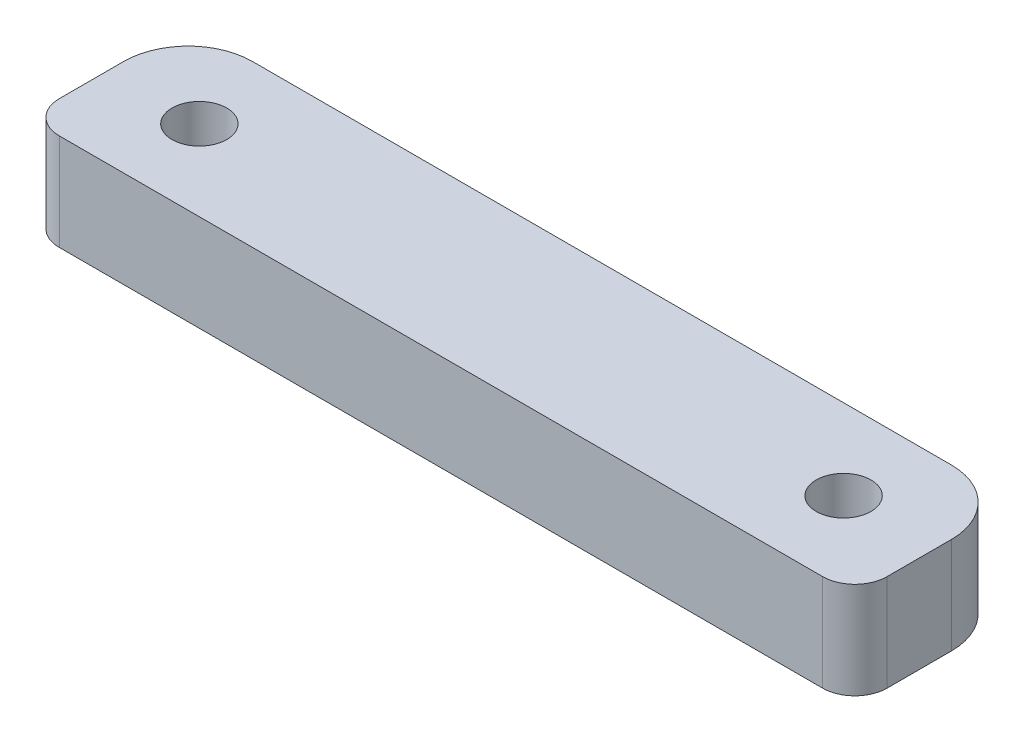
ISO-10303-21;
HEADER;
FILE_DESCRIPTION(('STEP AP214'),'2;1');
FILE_NAME('part.step','',(''),(''),'','','');
FILE_SCHEMA(('AUTOMOTIVE_DESIGN { 1 0 10303 214 1 1 1 1 }'));
ENDSEC;
DATA;
#1=APPLICATION_CONTEXT('core data for automotive mechanical design processes');
#2=APPLICATION_PROTOCOL_DEFINITION('international standard','automotive_design',2000,#1);
#3=PRODUCT_CONTEXT('',#1,'mechanical');
#4=PRODUCT('Part','Part','',(#3));
#5=PRODUCT_RELATED_PRODUCT_CATEGORY('part','',(#4));
#6=PRODUCT_DEFINITION_FORMATION('','',#4);
#7=PRODUCT_DEFINITION_CONTEXT('part definition',#1,'design');
#8=PRODUCT_DEFINITION('design','',#6,#7);
#9=PRODUCT_DEFINITION_SHAPE('','',#8);
#10=(LENGTH_UNIT() NAMED_UNIT(*) SI_UNIT(.MILLI.,.METRE.));
#11=(NAMED_UNIT(*) PLANE_ANGLE_UNIT() SI_UNIT($,.RADIAN.));
#12=(NAMED_UNIT(*) SI_UNIT($,.STERADIAN.) SOLID_ANGLE_UNIT());
#13=UNCERTAINTY_MEASURE_WITH_UNIT(LENGTH_MEASURE(1.E-05),#10,'distance_accuracy_value','');
#14=(GEOMETRIC_REPRESENTATION_CONTEXT(3) GLOBAL_UNCERTAINTY_ASSIGNED_CONTEXT((#13)) GLOBAL_UNIT_ASSIGNED_CONTEXT((#10,
#11,#12)) REPRESENTATION_CONTEXT('',''));
#15=CARTESIAN_POINT('',(0.,0.,0.));
#16=DIRECTION('',(0.,0.,1.));
#17=DIRECTION('',(1.,0.,0.));
#18=AXIS2_PLACEMENT_3D('',#15,#16,#17);
#19=CARTESIAN_POINT('',(0.,6.,-5.));
#20=DIRECTION('',(0.,0.,-1.));
#21=DIRECTION('',(-1.,0.,0.));
#22=AXIS2_PLACEMENT_3D('',#19,#20,#21);
#23=PLANE('',#22);
#24=DIRECTION('',(1.,0.,0.));
#25=VECTOR('',#24,1.);
#26=CARTESIAN_POINT('',(0.,6.,-5.));
#27=LINE('',#26,#25);
#28=CARTESIAN_POINT('',(-21.7,6.,-5.));
#29=VERTEX_POINT('',#28);
#30=CARTESIAN_POINT('',(21.7,6.,-5.));
#31=VERTEX_POINT('',#30);
#32=EDGE_CURVE('E177',#29,#31,#27,.T.);
#33=ORIENTED_EDGE('',*,*,#32,.T.);
#34=DIRECTION('',(0.,-1.,0.));
#35=VECTOR('',#34,1.);
#36=CARTESIAN_POINT('',(21.7,0.,-5.));
#37=LINE('',#36,#35);
#38=CARTESIAN_POINT('',(21.7,0.,-5.));
#39=VERTEX_POINT('',#38);
#40=EDGE_CURVE('E215',#31,#39,#37,.T.);
#41=ORIENTED_EDGE('',*,*,#40,.T.);
#42=DIRECTION('',(1.,0.,0.));
#43=VECTOR('',#42,1.);
#44=CARTESIAN_POINT('',(0.,0.,-5.));
#45=LINE('',#44,#43);
#46=CARTESIAN_POINT('',(2.65,0.,-5.));
#47=VERTEX_POINT('',#46);
#48=EDGE_CURVE('E168',#47,#39,#45,.T.);
#49=ORIENTED_EDGE('',*,*,#48,.F.);
#50=DIRECTION('',(0.,-1.,0.));
#51=VECTOR('',#50,1.);
#52=CARTESIAN_POINT('',(2.65,3.8,-5.));
#53=LINE('',#52,#51);
#54=CARTESIAN_POINT('',(2.65,3.8,-5.));
#55=VERTEX_POINT('',#54);
#56=EDGE_CURVE('E164',#55,#47,#53,.T.);
#57=ORIENTED_EDGE('',*,*,#56,.F.);
#58=DIRECTION('',(1.,0.,0.));
#59=VECTOR('',#58,1.);
#60=CARTESIAN_POINT('',(0.,3.8,-5.));
#61=LINE('',#60,#59);
#62=CARTESIAN_POINT('',(-2.65,3.8,-5.));
#63=VERTEX_POINT('',#62);
#64=EDGE_CURVE('E143',#63,#55,#61,.T.);
#65=ORIENTED_EDGE('',*,*,#64,.F.);
#66=DIRECTION('',(0.,-1.,0.));
#67=VECTOR('',#66,1.);
#68=CARTESIAN_POINT('',(-2.65,3.8,-5.));
#69=LINE('',#68,#67);
#70=CARTESIAN_POINT('',(-2.65,0.,-5.));
#71=VERTEX_POINT('',#70);
#72=EDGE_CURVE('E170',#63,#71,#69,.T.);
#73=ORIENTED_EDGE('',*,*,#72,.T.);
#74=CARTESIAN_POINT('',(-21.7,0.,-5.));
#75=VERTEX_POINT('',#74);
#76=EDGE_CURVE('E197',#75,#71,#45,.T.);
#77=ORIENTED_EDGE('',*,*,#76,.F.);
#78=DIRECTION('',(0.,-1.,0.));
#79=VECTOR('',#78,1.);
#80=CARTESIAN_POINT('',(-21.7,6.,-5.));
#81=LINE('',#80,#79);
#82=EDGE_CURVE('E195',#75,#29,#81,.F.);
#83=ORIENTED_EDGE('',*,*,#82,.T.);
#84=EDGE_LOOP('',(#33,#41,#49,#57,#65,#73,#77,#83));
#85=FACE_BOUND('',#84,.T.);
#86=ADVANCED_FACE('F45',(#85),#23,.T.);
#87=CARTESIAN_POINT('',(0.,0.,0.));
#88=DIRECTION('',(0.,1.,0.));
#89=DIRECTION('',(0.,0.,1.));
#90=AXIS2_PLACEMENT_3D('',#87,#88,#89);
#91=PLANE('',#90);
#92=CARTESIAN_POINT('',(20.,0.,0.));
#93=DIRECTION('',(0.,1.,0.));
#94=DIRECTION('',(0.,0.,1.));
#95=AXIS2_PLACEMENT_3D('',#92,#93,#94);
#96=CIRCLE('',#95,1.7);
#97=CARTESIAN_POINT('',(20.,0.,1.7));
#98=VERTEX_POINT('',#97);
#99=EDGE_CURVE('E178',#98,#98,#96,.F.);
#100=ORIENTED_EDGE('',*,*,#99,.F.);
#101=EDGE_LOOP('',(#100));
#102=FACE_BOUND('',#101,.T.);
#103=CARTESIAN_POINT('',(-20.,0.,0.));
#104=DIRECTION('',(0.,1.,0.));
#105=DIRECTION('',(0.,0.,1.));
#106=AXIS2_PLACEMENT_3D('',#103,#104,#105);
#107=CIRCLE('',#106,1.7);
#108=CARTESIAN_POINT('',(-20.,0.,1.7));
#109=VERTEX_POINT('',#108);
#110=EDGE_CURVE('E206',#109,#109,#107,.T.);
#111=ORIENTED_EDGE('',*,*,#110,.T.);
#112=EDGE_LOOP('',(#111));
#113=FACE_BOUND('',#112,.T.);
#114=DIRECTION('',(0.,0.,-1.));
#115=VECTOR('',#114,1.);
#116=CARTESIAN_POINT('',(25.7,0.,0.));
#117=LINE('',#116,#115);
#118=CARTESIAN_POINT('',(25.7,0.,3.));
#119=VERTEX_POINT('',#118);
#120=CARTESIAN_POINT('',(25.7,0.,-1.));
#121=VERTEX_POINT('',#120);
#122=EDGE_CURVE('E163',#119,#121,#117,.T.);
#123=ORIENTED_EDGE('',*,*,#122,.F.);
#124=CARTESIAN_POINT('',(23.7,0.,3.));
#125=DIRECTION('',(0.,1.,0.));
#126=DIRECTION('',(0.,0.,1.));
#127=AXIS2_PLACEMENT_3D('',#124,#125,#126);
#128=CIRCLE('',#127,2.);
#129=CARTESIAN_POINT('',(23.7,0.,5.));
#130=VERTEX_POINT('',#129);
#131=EDGE_CURVE('E248',#119,#130,#128,.F.);
#132=ORIENTED_EDGE('',*,*,#131,.T.);
#133=DIRECTION('',(1.,0.,0.));
#134=VECTOR('',#133,1.);
#135=CARTESIAN_POINT('',(0.,0.,5.));
#136=LINE('',#135,#134);
#137=CARTESIAN_POINT('',(-23.7,0.,5.));
#138=VERTEX_POINT('',#137);
#139=EDGE_CURVE('E203',#138,#130,#136,.T.);
#140=ORIENTED_EDGE('',*,*,#139,.F.);
#141=CARTESIAN_POINT('',(-23.7,0.,3.));
#142=DIRECTION('',(0.,1.,0.));
#143=DIRECTION('',(0.,0.,1.));
#144=AXIS2_PLACEMENT_3D('',#141,#142,#143);
#145=CIRCLE('',#144,2.);
#146=CARTESIAN_POINT('',(-25.7,0.,3.));
#147=VERTEX_POINT('',#146);
#148=EDGE_CURVE('E245',#138,#147,#145,.F.);
#149=ORIENTED_EDGE('',*,*,#148,.T.);
#150=DIRECTION('',(0.,0.,-1.));
#151=VECTOR('',#150,1.);
#152=CARTESIAN_POINT('',(-25.7,0.,0.));
#153=LINE('',#152,#151);
#154=CARTESIAN_POINT('',(-25.7,0.,-1.));
#155=VERTEX_POINT('',#154);
#156=EDGE_CURVE('E200',#147,#155,#153,.T.);
#157=ORIENTED_EDGE('',*,*,#156,.T.);
#158=CARTESIAN_POINT('',(-21.7,0.,-1.));
#159=DIRECTION('',(0.,1.,0.));
#160=DIRECTION('',(0.,0.,1.));
#161=AXIS2_PLACEMENT_3D('',#158,#159,#160);
#162=CIRCLE('',#161,4.);
#163=EDGE_CURVE('E219',#155,#75,#162,.F.);
#164=ORIENTED_EDGE('',*,*,#163,.T.);
#165=ORIENTED_EDGE('',*,*,#76,.T.);
#166=DIRECTION('',(0.,0.,-1.));
#167=VECTOR('',#166,1.);
#168=CARTESIAN_POINT('',(-2.65,0.,0.));
#169=LINE('',#168,#167);
#170=CARTESIAN_POINT('',(-2.65,0.,2.2));
#171=VERTEX_POINT('',#170);
#172=EDGE_CURVE('E157',#171,#71,#169,.T.);
#173=ORIENTED_EDGE('',*,*,#172,.F.);
#174=DIRECTION('',(1.,0.,0.));
#175=VECTOR('',#174,1.);
#176=CARTESIAN_POINT('',(0.,0.,2.2));
#177=LINE('',#176,#175);
#178=CARTESIAN_POINT('',(2.65,0.,2.2));
#179=VERTEX_POINT('',#178);
#180=EDGE_CURVE('E303',#171,#179,#177,.T.);
#181=ORIENTED_EDGE('',*,*,#180,.T.);
#182=DIRECTION('',(0.,0.,-1.));
#183=VECTOR('',#182,1.);
#184=CARTESIAN_POINT('',(2.65,0.,0.));
#185=LINE('',#184,#183);
#186=EDGE_CURVE('E161',#179,#47,#185,.T.);
#187=ORIENTED_EDGE('',*,*,#186,.T.);
#188=ORIENTED_EDGE('',*,*,#48,.T.);
#189=CARTESIAN_POINT('',(21.7,0.,-1.));
#190=DIRECTION('',(0.,1.,0.));
#191=DIRECTION('',(0.,0.,1.));
#192=AXIS2_PLACEMENT_3D('',#189,#190,#191);
#193=CIRCLE('',#192,4.);
#194=EDGE_CURVE('E222',#39,#121,#193,.F.);
#195=ORIENTED_EDGE('',*,*,#194,.T.);
#196=EDGE_LOOP('',(#123,#132,#140,#149,#157,#164,#165,#173,#181,#187,#188,#195));
#197=FACE_BOUND('',#196,.T.);
#198=ADVANCED_FACE('F275',(#102,#113,#197),#91,.F.);
#199=CARTESIAN_POINT('',(25.7,6.,0.));
#200=DIRECTION('',(-1.,0.,0.));
#201=DIRECTION('',(0.,0.,1.));
#202=AXIS2_PLACEMENT_3D('',#199,#200,#201);
#203=PLANE('',#202);
#204=DIRECTION('',(0.,0.,-1.));
#205=VECTOR('',#204,1.);
#206=CARTESIAN_POINT('',(25.7,6.,0.));
#207=LINE('',#206,#205);
#208=CARTESIAN_POINT('',(25.7,6.,3.));
#209=VERTEX_POINT('',#208);
#210=CARTESIAN_POINT('',(25.7,6.,-1.));
#211=VERTEX_POINT('',#210);
#212=EDGE_CURVE('E174',#209,#211,#207,.T.);
#213=ORIENTED_EDGE('',*,*,#212,.F.);
#214=DIRECTION('',(0.,-1.,0.));
#215=VECTOR('',#214,1.);
#216=CARTESIAN_POINT('',(25.7,6.,3.));
#217=LINE('',#216,#215);
#218=EDGE_CURVE('E241',#209,#119,#217,.T.);
#219=ORIENTED_EDGE('',*,*,#218,.T.);
#220=ORIENTED_EDGE('',*,*,#122,.T.);
#221=DIRECTION('',(0.,-1.,0.));
#222=VECTOR('',#221,1.);
#223=CARTESIAN_POINT('',(25.7,6.,-1.));
#224=LINE('',#223,#222);
#225=EDGE_CURVE('E226',#121,#211,#224,.F.);
#226=ORIENTED_EDGE('',*,*,#225,.T.);
#227=EDGE_LOOP('',(#213,#219,#220,#226));
#228=FACE_BOUND('',#227,.T.);
#229=ADVANCED_FACE('F268',(#228),#203,.F.);
#230=CARTESIAN_POINT('',(-25.7,6.,0.));
#231=DIRECTION('',(-1.,0.,0.));
#232=DIRECTION('',(0.,0.,1.));
#233=AXIS2_PLACEMENT_3D('',#230,#231,#232);
#234=PLANE('',#233);
#235=ORIENTED_EDGE('',*,*,#156,.F.);
#236=DIRECTION('',(0.,-1.,0.));
#237=VECTOR('',#236,1.);
#238=CARTESIAN_POINT('',(-25.7,6.,3.));
#239=LINE('',#238,#237);
#240=CARTESIAN_POINT('',(-25.7,6.,3.));
#241=VERTEX_POINT('',#240);
#242=EDGE_CURVE('E11',#147,#241,#239,.F.);
#243=ORIENTED_EDGE('',*,*,#242,.T.);
#244=DIRECTION('',(0.,0.,-1.));
#245=VECTOR('',#244,1.);
#246=CARTESIAN_POINT('',(-25.7,6.,0.));
#247=LINE('',#246,#245);
#248=CARTESIAN_POINT('',(-25.7,6.,-1.));
#249=VERTEX_POINT('',#248);
#250=EDGE_CURVE('E182',#241,#249,#247,.T.);
#251=ORIENTED_EDGE('',*,*,#250,.T.);
#252=DIRECTION('',(0.,-1.,0.));
#253=VECTOR('',#252,1.);
#254=CARTESIAN_POINT('',(-25.7,6.,-1.));
#255=LINE('',#254,#253);
#256=EDGE_CURVE('E237',#249,#155,#255,.T.);
#257=ORIENTED_EDGE('',*,*,#256,.T.);
#258=EDGE_LOOP('',(#235,#243,#251,#257));
#259=FACE_BOUND('',#258,.T.);
#260=ADVANCED_FACE('F281',(#259),#234,.T.);
#261=CARTESIAN_POINT('',(-20.,6.,0.));
#262=DIRECTION('',(0.,-1.,0.));
#263=DIRECTION('',(0.,0.,-1.));
#264=AXIS2_PLACEMENT_3D('',#261,#262,#263);
#265=CYLINDRICAL_SURFACE('',#264,1.7);
#266=CARTESIAN_POINT('',(-20.,6.,0.));
#267=DIRECTION('',(0.,1.,0.));
#268=DIRECTION('',(0.,0.,1.));
#269=AXIS2_PLACEMENT_3D('',#266,#267,#268);
#270=CIRCLE('',#269,1.7);
#271=CARTESIAN_POINT('',(-20.,6.,1.7));
#272=VERTEX_POINT('',#271);
#273=EDGE_CURVE('E188',#272,#272,#270,.T.);
#274=ORIENTED_EDGE('',*,*,#273,.T.);
#275=EDGE_LOOP('',(#274));
#276=FACE_BOUND('',#275,.T.);
#277=ORIENTED_EDGE('',*,*,#110,.F.);
#278=EDGE_LOOP('',(#277));
#279=FACE_BOUND('',#278,.T.);
#280=ADVANCED_FACE('F338',(#276,#279),#265,.F.);
#281=CARTESIAN_POINT('',(0.,6.,5.));
#282=DIRECTION('',(0.,0.,-1.));
#283=DIRECTION('',(-1.,0.,0.));
#284=AXIS2_PLACEMENT_3D('',#281,#282,#283);
#285=PLANE('',#284);
#286=ORIENTED_EDGE('',*,*,#139,.T.);
#287=DIRECTION('',(0.,-1.,0.));
#288=VECTOR('',#287,1.);
#289=CARTESIAN_POINT('',(23.7,6.,5.));
#290=LINE('',#289,#288);
#291=CARTESIAN_POINT('',(23.7,6.,5.));
#292=VERTEX_POINT('',#291);
#293=EDGE_CURVE('E67',#130,#292,#290,.F.);
#294=ORIENTED_EDGE('',*,*,#293,.T.);
#295=DIRECTION('',(1.,0.,0.));
#296=VECTOR('',#295,1.);
#297=CARTESIAN_POINT('',(0.,6.,5.));
#298=LINE('',#297,#296);
#299=CARTESIAN_POINT('',(-23.7,6.,5.));
#300=VERTEX_POINT('',#299);
#301=EDGE_CURVE('E185',#300,#292,#298,.T.);
#302=ORIENTED_EDGE('',*,*,#301,.F.);
#303=DIRECTION('',(0.,-1.,0.));
#304=VECTOR('',#303,1.);
#305=CARTESIAN_POINT('',(-23.7,0.,5.));
#306=LINE('',#305,#304);
#307=EDGE_CURVE('E251',#300,#138,#306,.T.);
#308=ORIENTED_EDGE('',*,*,#307,.T.);
#309=EDGE_LOOP('',(#286,#294,#302,#308));
#310=FACE_BOUND('',#309,.T.);
#311=ADVANCED_FACE('F276',(#310),#285,.F.);
#312=CARTESIAN_POINT('',(20.,6.,0.));
#313=DIRECTION('',(0.,-1.,0.));
#314=DIRECTION('',(0.,0.,-1.));
#315=AXIS2_PLACEMENT_3D('',#312,#313,#314);
#316=CYLINDRICAL_SURFACE('',#315,1.7);
#317=CARTESIAN_POINT('',(20.,6.,0.));
#318=DIRECTION('',(0.,1.,0.));
#319=DIRECTION('',(0.,0.,1.));
#320=AXIS2_PLACEMENT_3D('',#317,#318,#319);
#321=CIRCLE('',#320,1.7);
#322=CARTESIAN_POINT('',(20.,6.,1.7));
#323=VERTEX_POINT('',#322);
#324=EDGE_CURVE('E192',#323,#323,#321,.F.);
#325=ORIENTED_EDGE('',*,*,#324,.F.);
#326=EDGE_LOOP('',(#325));
#327=FACE_BOUND('',#326,.T.);
#328=ORIENTED_EDGE('',*,*,#99,.T.);
#329=EDGE_LOOP('',(#328));
#330=FACE_BOUND('',#329,.T.);
#331=ADVANCED_FACE('F347',(#327,#330),#316,.F.);
#332=CARTESIAN_POINT('',(0.,6.,0.));
#333=DIRECTION('',(0.,1.,0.));
#334=DIRECTION('',(0.,0.,1.));
#335=AXIS2_PLACEMENT_3D('',#332,#333,#334);
#336=PLANE('',#335);
#337=ORIENTED_EDGE('',*,*,#301,.T.);
#338=CARTESIAN_POINT('',(23.7,6.,3.));
#339=DIRECTION('',(0.,1.,0.));
#340=DIRECTION('',(0.,0.,1.));
#341=AXIS2_PLACEMENT_3D('',#338,#339,#340);
#342=CIRCLE('',#341,2.);
#343=EDGE_CURVE('E54',#292,#209,#342,.T.);
#344=ORIENTED_EDGE('',*,*,#343,.T.);
#345=ORIENTED_EDGE('',*,*,#212,.T.);
#346=CARTESIAN_POINT('',(21.7,6.,-1.));
#347=DIRECTION('',(0.,1.,0.));
#348=DIRECTION('',(0.,0.,1.));
#349=AXIS2_PLACEMENT_3D('',#346,#347,#348);
#350=CIRCLE('',#349,4.);
#351=EDGE_CURVE('E234',#211,#31,#350,.T.);
#352=ORIENTED_EDGE('',*,*,#351,.T.);
#353=ORIENTED_EDGE('',*,*,#32,.F.);
#354=CARTESIAN_POINT('',(-21.7,6.,-1.));
#355=DIRECTION('',(0.,1.,0.));
#356=DIRECTION('',(0.,0.,1.));
#357=AXIS2_PLACEMENT_3D('',#354,#355,#356);
#358=CIRCLE('',#357,4.);
#359=EDGE_CURVE('E230',#29,#249,#358,.T.);
#360=ORIENTED_EDGE('',*,*,#359,.T.);
#361=ORIENTED_EDGE('',*,*,#250,.F.);
#362=CARTESIAN_POINT('',(-23.7,6.,3.));
#363=DIRECTION('',(0.,1.,0.));
#364=DIRECTION('',(0.,0.,1.));
#365=AXIS2_PLACEMENT_3D('',#362,#363,#364);
#366=CIRCLE('',#365,2.);
#367=EDGE_CURVE('E257',#241,#300,#366,.T.);
#368=ORIENTED_EDGE('',*,*,#367,.T.);
#369=EDGE_LOOP('',(#337,#344,#345,#352,#353,#360,#361,#368));
#370=FACE_BOUND('',#369,.T.);
#371=ORIENTED_EDGE('',*,*,#273,.F.);
#372=EDGE_LOOP('',(#371));
#373=FACE_BOUND('',#372,.T.);
#374=ORIENTED_EDGE('',*,*,#324,.T.);
#375=EDGE_LOOP('',(#374));
#376=FACE_BOUND('',#375,.T.);
#377=ADVANCED_FACE('F263',(#370,#373,#376),#336,.T.);
#378=CARTESIAN_POINT('',(0.,3.8,2.2));
#379=DIRECTION('',(0.,0.,-1.));
#380=DIRECTION('',(-1.,0.,0.));
#381=AXIS2_PLACEMENT_3D('',#378,#379,#380);
#382=PLANE('',#381);
#383=ORIENTED_EDGE('',*,*,#180,.F.);
#384=DIRECTION('',(0.,-1.,0.));
#385=VECTOR('',#384,1.);
#386=CARTESIAN_POINT('',(-2.65,3.8,2.2));
#387=LINE('',#386,#385);
#388=CARTESIAN_POINT('',(-2.65,3.8,2.2));
#389=VERTEX_POINT('',#388);
#390=EDGE_CURVE('E155',#389,#171,#387,.T.);
#391=ORIENTED_EDGE('',*,*,#390,.F.);
#392=DIRECTION('',(1.,0.,0.));
#393=VECTOR('',#392,1.);
#394=CARTESIAN_POINT('',(0.,3.8,2.2));
#395=LINE('',#394,#393);
#396=CARTESIAN_POINT('',(2.65,3.8,2.2));
#397=VERTEX_POINT('',#396);
#398=EDGE_CURVE('E140',#389,#397,#395,.T.);
#399=ORIENTED_EDGE('',*,*,#398,.T.);
#400=DIRECTION('',(0.,-1.,0.));
#401=VECTOR('',#400,1.);
#402=CARTESIAN_POINT('',(2.65,3.8,2.2));
#403=LINE('',#402,#401);
#404=EDGE_CURVE('E152',#397,#179,#403,.T.);
#405=ORIENTED_EDGE('',*,*,#404,.T.);
#406=EDGE_LOOP('',(#383,#391,#399,#405));
#407=FACE_BOUND('',#406,.T.);
#408=ADVANCED_FACE('F151',(#407),#382,.T.);
#409=CARTESIAN_POINT('',(2.65,3.8,0.));
#410=DIRECTION('',(-1.,0.,0.));
#411=DIRECTION('',(0.,0.,1.));
#412=AXIS2_PLACEMENT_3D('',#409,#410,#411);
#413=PLANE('',#412);
#414=ORIENTED_EDGE('',*,*,#186,.F.);
#415=ORIENTED_EDGE('',*,*,#404,.F.);
#416=DIRECTION('',(0.,0.,-1.));
#417=VECTOR('',#416,1.);
#418=CARTESIAN_POINT('',(2.65,3.8,0.));
#419=LINE('',#418,#417);
#420=EDGE_CURVE('E136',#397,#55,#419,.T.);
#421=ORIENTED_EDGE('',*,*,#420,.T.);
#422=ORIENTED_EDGE('',*,*,#56,.T.);
#423=EDGE_LOOP('',(#414,#415,#421,#422));
#424=FACE_BOUND('',#423,.T.);
#425=ADVANCED_FACE('F159',(#424),#413,.T.);
#426=CARTESIAN_POINT('',(-2.65,3.8,0.));
#427=DIRECTION('',(-1.,0.,0.));
#428=DIRECTION('',(0.,0.,1.));
#429=AXIS2_PLACEMENT_3D('',#426,#427,#428);
#430=PLANE('',#429);
#431=ORIENTED_EDGE('',*,*,#172,.T.);
#432=ORIENTED_EDGE('',*,*,#72,.F.);
#433=DIRECTION('',(0.,0.,-1.));
#434=VECTOR('',#433,1.);
#435=CARTESIAN_POINT('',(-2.65,3.8,0.));
#436=LINE('',#435,#434);
#437=EDGE_CURVE('E296',#389,#63,#436,.T.);
#438=ORIENTED_EDGE('',*,*,#437,.F.);
#439=ORIENTED_EDGE('',*,*,#390,.T.);
#440=EDGE_LOOP('',(#431,#432,#438,#439));
#441=FACE_BOUND('',#440,.T.);
#442=ADVANCED_FACE('F309',(#441),#430,.F.);
#443=CARTESIAN_POINT('',(0.,3.8,0.));
#444=DIRECTION('',(0.,1.,0.));
#445=DIRECTION('',(0.,0.,1.));
#446=AXIS2_PLACEMENT_3D('',#443,#444,#445);
#447=PLANE('',#446);
#448=ORIENTED_EDGE('',*,*,#398,.F.);
#449=ORIENTED_EDGE('',*,*,#437,.T.);
#450=ORIENTED_EDGE('',*,*,#64,.T.);
#451=ORIENTED_EDGE('',*,*,#420,.F.);
#452=EDGE_LOOP('',(#448,#449,#450,#451));
#453=FACE_BOUND('',#452,.T.);
#454=ADVANCED_FACE('F138',(#453),#447,.F.);
#455=CARTESIAN_POINT('',(21.7,6.,-1.));
#456=DIRECTION('',(0.,1.,0.));
#457=DIRECTION('',(0.,0.,1.));
#458=AXIS2_PLACEMENT_3D('',#455,#456,#457);
#459=CYLINDRICAL_SURFACE('',#458,4.);
#460=ORIENTED_EDGE('',*,*,#351,.F.);
#461=ORIENTED_EDGE('',*,*,#225,.F.);
#462=ORIENTED_EDGE('',*,*,#194,.F.);
#463=ORIENTED_EDGE('',*,*,#40,.F.);
#464=EDGE_LOOP('',(#460,#461,#462,#463));
#465=FACE_BOUND('',#464,.T.);
#466=ADVANCED_FACE('F315',(#465),#459,.T.);
#467=CARTESIAN_POINT('',(-21.7,6.,-1.));
#468=DIRECTION('',(0.,-1.,0.));
#469=DIRECTION('',(0.,0.,-1.));
#470=AXIS2_PLACEMENT_3D('',#467,#468,#469);
#471=CYLINDRICAL_SURFACE('',#470,4.);
#472=ORIENTED_EDGE('',*,*,#359,.F.);
#473=ORIENTED_EDGE('',*,*,#82,.F.);
#474=ORIENTED_EDGE('',*,*,#163,.F.);
#475=ORIENTED_EDGE('',*,*,#256,.F.);
#476=EDGE_LOOP('',(#472,#473,#474,#475));
#477=FACE_BOUND('',#476,.T.);
#478=ADVANCED_FACE('F285',(#477),#471,.T.);
#479=CARTESIAN_POINT('',(23.7,6.,3.));
#480=DIRECTION('',(0.,-1.,0.));
#481=DIRECTION('',(0.,0.,-1.));
#482=AXIS2_PLACEMENT_3D('',#479,#480,#481);
#483=CYLINDRICAL_SURFACE('',#482,2.);
#484=ORIENTED_EDGE('',*,*,#343,.F.);
#485=ORIENTED_EDGE('',*,*,#293,.F.);
#486=ORIENTED_EDGE('',*,*,#131,.F.);
#487=ORIENTED_EDGE('',*,*,#218,.F.);
#488=EDGE_LOOP('',(#484,#485,#486,#487));
#489=FACE_BOUND('',#488,.T.);
#490=ADVANCED_FACE('F272',(#489),#483,.T.);
#491=CARTESIAN_POINT('',(-23.7,6.,3.));
#492=DIRECTION('',(0.,1.,0.));
#493=DIRECTION('',(0.,0.,1.));
#494=AXIS2_PLACEMENT_3D('',#491,#492,#493);
#495=CYLINDRICAL_SURFACE('',#494,2.);
#496=ORIENTED_EDGE('',*,*,#367,.F.);
#497=ORIENTED_EDGE('',*,*,#242,.F.);
#498=ORIENTED_EDGE('',*,*,#148,.F.);
#499=ORIENTED_EDGE('',*,*,#307,.F.);
#500=EDGE_LOOP('',(#496,#497,#498,#499));
#501=FACE_BOUND('',#500,.T.);
#502=ADVANCED_FACE('F47',(#501),#495,.T.);
#503=CLOSED_SHELL('',(#86,#198,#229,#260,#280,#311,#331,#377,#408,#425,#442,#454,#466,#478,#490,#502));
#504=MANIFOLD_SOLID_BREP('B2',#503);
#505=ADVANCED_BREP_SHAPE_REPRESENTATION('',(#18,#504),#14);
#506=SHAPE_DEFINITION_REPRESENTATION(#9,#505);
ENDSEC;
END-ISO-10303-21;
